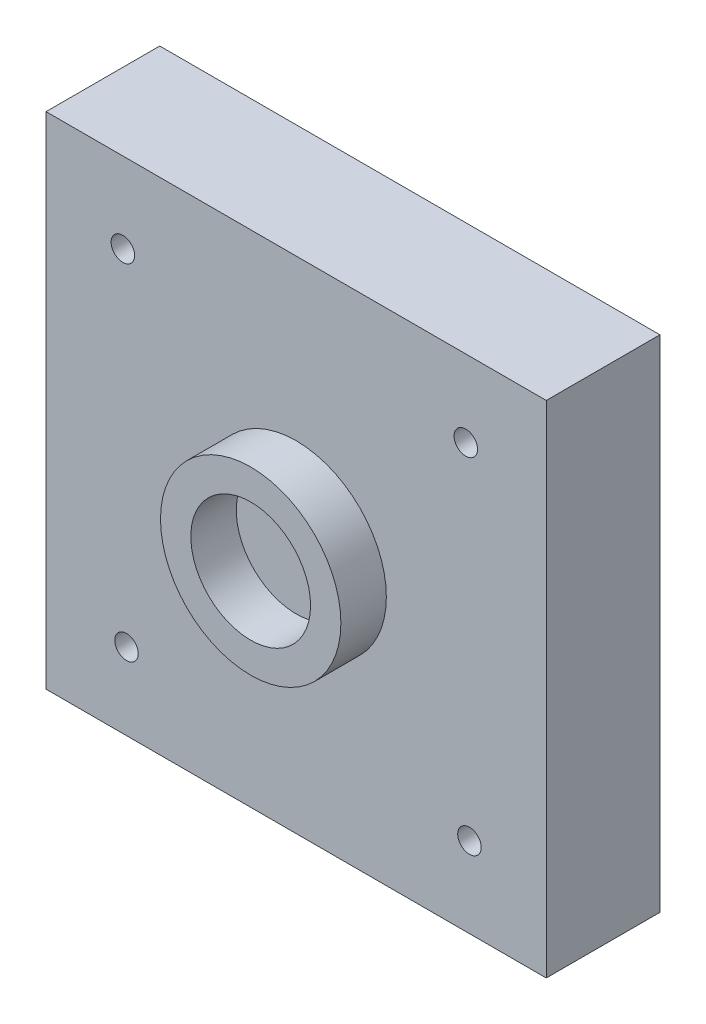
ISO-10303-21;
HEADER;
FILE_DESCRIPTION(('STEP AP214'),'2;1');
FILE_NAME('part.step','',(''),(''),'','','');
FILE_SCHEMA(('AUTOMOTIVE_DESIGN { 1 0 10303 214 1 1 1 1 }'));
ENDSEC;
DATA;
#1=APPLICATION_CONTEXT('core data for automotive mechanical design processes');
#2=APPLICATION_PROTOCOL_DEFINITION('international standard','automotive_design',2000,#1);
#3=PRODUCT_CONTEXT('',#1,'mechanical');
#4=PRODUCT('Part','Part','',(#3));
#5=PRODUCT_RELATED_PRODUCT_CATEGORY('part','',(#4));
#6=PRODUCT_DEFINITION_FORMATION('','',#4);
#7=PRODUCT_DEFINITION_CONTEXT('part definition',#1,'design');
#8=PRODUCT_DEFINITION('design','',#6,#7);
#9=PRODUCT_DEFINITION_SHAPE('','',#8);
#10=(LENGTH_UNIT() NAMED_UNIT(*) SI_UNIT(.MILLI.,.METRE.));
#11=(NAMED_UNIT(*) PLANE_ANGLE_UNIT() SI_UNIT($,.RADIAN.));
#12=(NAMED_UNIT(*) SI_UNIT($,.STERADIAN.) SOLID_ANGLE_UNIT());
#13=UNCERTAINTY_MEASURE_WITH_UNIT(LENGTH_MEASURE(1.E-05),#10,'distance_accuracy_value','');
#14=(GEOMETRIC_REPRESENTATION_CONTEXT(3) GLOBAL_UNCERTAINTY_ASSIGNED_CONTEXT((#13)) GLOBAL_UNIT_ASSIGNED_CONTEXT((#10,
#11,#12)) REPRESENTATION_CONTEXT('',''));
#15=CARTESIAN_POINT('',(0.,0.,0.));
#16=DIRECTION('',(0.,0.,1.));
#17=DIRECTION('',(1.,0.,0.));
#18=AXIS2_PLACEMENT_3D('',#15,#16,#17);
#19=CARTESIAN_POINT('',(0.,0.,15.));
#20=DIRECTION('',(0.,0.,1.));
#21=DIRECTION('',(1.,0.,0.));
#22=AXIS2_PLACEMENT_3D('',#19,#20,#21);
#23=PLANE('',#22);
#24=CARTESIAN_POINT('',(0.,0.,15.));
#25=DIRECTION('',(0.,0.,1.));
#26=DIRECTION('',(1.,0.,0.));
#27=AXIS2_PLACEMENT_3D('',#24,#25,#26);
#28=CIRCLE('',#27,11.9);
#29=CARTESIAN_POINT('',(11.9,0.,15.));
#30=VERTEX_POINT('',#29);
#31=EDGE_CURVE('E297',#30,#30,#28,.T.);
#32=ORIENTED_EDGE('',*,*,#31,.F.);
#33=EDGE_LOOP('',(#32));
#34=FACE_BOUND('',#33,.T.);
#35=DIRECTION('',(0.,1.,0.));
#36=VECTOR('',#35,1.);
#37=CARTESIAN_POINT('',(33.,0.,15.));
#38=LINE('',#37,#36);
#39=CARTESIAN_POINT('',(33.,-33.,15.));
#40=VERTEX_POINT('',#39);
#41=CARTESIAN_POINT('',(33.,33.,15.));
#42=VERTEX_POINT('',#41);
#43=EDGE_CURVE('E186',#40,#42,#38,.T.);
#44=ORIENTED_EDGE('',*,*,#43,.T.);
#45=DIRECTION('',(-1.,0.,0.));
#46=VECTOR('',#45,1.);
#47=CARTESIAN_POINT('',(0.,33.,15.));
#48=LINE('',#47,#46);
#49=CARTESIAN_POINT('',(-33.,33.,15.));
#50=VERTEX_POINT('',#49);
#51=EDGE_CURVE('E189',#42,#50,#48,.T.);
#52=ORIENTED_EDGE('',*,*,#51,.T.);
#53=DIRECTION('',(0.,-1.,0.));
#54=VECTOR('',#53,1.);
#55=CARTESIAN_POINT('',(-33.,0.,15.));
#56=LINE('',#55,#54);
#57=CARTESIAN_POINT('',(-33.,-33.,15.));
#58=VERTEX_POINT('',#57);
#59=EDGE_CURVE('E192',#50,#58,#56,.T.);
#60=ORIENTED_EDGE('',*,*,#59,.T.);
#61=DIRECTION('',(1.,0.,0.));
#62=VECTOR('',#61,1.);
#63=CARTESIAN_POINT('',(0.,-33.,15.));
#64=LINE('',#63,#62);
#65=EDGE_CURVE('E194',#58,#40,#64,.T.);
#66=ORIENTED_EDGE('',*,*,#65,.T.);
#67=EDGE_LOOP('',(#44,#52,#60,#66));
#68=FACE_BOUND('',#67,.T.);
#69=CARTESIAN_POINT('',(22.3843001966621,22.8679492894688,15.));
#70=DIRECTION('',(0.,0.,1.));
#71=DIRECTION('',(1.,0.,0.));
#72=AXIS2_PLACEMENT_3D('',#69,#70,#71);
#73=CIRCLE('',#72,1.55);
#74=CARTESIAN_POINT('',(23.9343001966621,22.8679492894688,15.));
#75=VERTEX_POINT('',#74);
#76=EDGE_CURVE('E165',#75,#75,#73,.T.);
#77=ORIENTED_EDGE('',*,*,#76,.F.);
#78=EDGE_LOOP('',(#77));
#79=FACE_BOUND('',#78,.T.);
#80=CARTESIAN_POINT('',(22.8679492894694,-22.3843001966621,15.));
#81=DIRECTION('',(0.,0.,1.));
#82=DIRECTION('',(1.,0.,0.));
#83=AXIS2_PLACEMENT_3D('',#80,#81,#82);
#84=CIRCLE('',#83,1.54999999999987);
#85=CARTESIAN_POINT('',(24.4179492894693,-22.3843001966621,15.));
#86=VERTEX_POINT('',#85);
#87=EDGE_CURVE('E260',#86,#86,#84,.T.);
#88=ORIENTED_EDGE('',*,*,#87,.F.);
#89=EDGE_LOOP('',(#88));
#90=FACE_BOUND('',#89,.T.);
#91=CARTESIAN_POINT('',(-22.3843001966614,-22.8679492894694,15.));
#92=DIRECTION('',(0.,0.,1.));
#93=DIRECTION('',(1.,0.,0.));
#94=AXIS2_PLACEMENT_3D('',#91,#92,#93);
#95=CIRCLE('',#94,1.55000000000053);
#96=CARTESIAN_POINT('',(-20.8343001966609,-22.8679492894694,15.));
#97=VERTEX_POINT('',#96);
#98=EDGE_CURVE('E253',#97,#97,#95,.T.);
#99=ORIENTED_EDGE('',*,*,#98,.F.);
#100=EDGE_LOOP('',(#99));
#101=FACE_BOUND('',#100,.T.);
#102=CARTESIAN_POINT('',(-22.8679492894688,22.3843001966614,15.));
#103=DIRECTION('',(0.,0.,1.));
#104=DIRECTION('',(1.,0.,0.));
#105=AXIS2_PLACEMENT_3D('',#102,#103,#104);
#106=CIRCLE('',#105,1.55000000000076);
#107=CARTESIAN_POINT('',(-21.317949289468,22.3843001966614,15.));
#108=VERTEX_POINT('',#107);
#109=EDGE_CURVE('E249',#108,#108,#106,.T.);
#110=ORIENTED_EDGE('',*,*,#109,.F.);
#111=EDGE_LOOP('',(#110));
#112=FACE_BOUND('',#111,.T.);
#113=ADVANCED_FACE('F83',(#34,#68,#79,#90,#101,#112),#23,.T.);
#114=CARTESIAN_POINT('',(0.,0.,0.));
#115=DIRECTION('',(0.,0.,1.));
#116=DIRECTION('',(1.,0.,0.));
#117=AXIS2_PLACEMENT_3D('',#114,#115,#116);
#118=PLANE('',#117);
#119=DIRECTION('',(0.,1.,0.));
#120=VECTOR('',#119,1.);
#121=CARTESIAN_POINT('',(33.,0.,0.));
#122=LINE('',#121,#120);
#123=CARTESIAN_POINT('',(33.,-33.,0.));
#124=VERTEX_POINT('',#123);
#125=CARTESIAN_POINT('',(33.,33.,0.));
#126=VERTEX_POINT('',#125);
#127=EDGE_CURVE('E185',#124,#126,#122,.T.);
#128=ORIENTED_EDGE('',*,*,#127,.F.);
#129=DIRECTION('',(1.,0.,0.));
#130=VECTOR('',#129,1.);
#131=CARTESIAN_POINT('',(0.,-33.,0.));
#132=LINE('',#131,#130);
#133=CARTESIAN_POINT('',(-33.,-33.,0.));
#134=VERTEX_POINT('',#133);
#135=EDGE_CURVE('E190',#134,#124,#132,.T.);
#136=ORIENTED_EDGE('',*,*,#135,.F.);
#137=DIRECTION('',(0.,-1.,0.));
#138=VECTOR('',#137,1.);
#139=CARTESIAN_POINT('',(-33.,0.,0.));
#140=LINE('',#139,#138);
#141=CARTESIAN_POINT('',(-33.,33.,0.));
#142=VERTEX_POINT('',#141);
#143=EDGE_CURVE('E201',#142,#134,#140,.T.);
#144=ORIENTED_EDGE('',*,*,#143,.F.);
#145=DIRECTION('',(-1.,0.,0.));
#146=VECTOR('',#145,1.);
#147=CARTESIAN_POINT('',(0.,33.,0.));
#148=LINE('',#147,#146);
#149=EDGE_CURVE('E199',#126,#142,#148,.T.);
#150=ORIENTED_EDGE('',*,*,#149,.F.);
#151=EDGE_LOOP('',(#128,#136,#144,#150));
#152=FACE_BOUND('',#151,.T.);
#153=DIRECTION('',(0.,1.,0.));
#154=VECTOR('',#153,1.);
#155=CARTESIAN_POINT('',(30.,30.,0.));
#156=LINE('',#155,#154);
#157=CARTESIAN_POINT('',(30.,-30.,0.));
#158=VERTEX_POINT('',#157);
#159=CARTESIAN_POINT('',(30.,30.,0.));
#160=VERTEX_POINT('',#159);
#161=EDGE_CURVE('E168',#158,#160,#156,.T.);
#162=ORIENTED_EDGE('',*,*,#161,.T.);
#163=DIRECTION('',(-1.,0.,0.));
#164=VECTOR('',#163,1.);
#165=CARTESIAN_POINT('',(30.,30.,0.));
#166=LINE('',#165,#164);
#167=CARTESIAN_POINT('',(-30.,30.,0.));
#168=VERTEX_POINT('',#167);
#169=EDGE_CURVE('E171',#160,#168,#166,.T.);
#170=ORIENTED_EDGE('',*,*,#169,.T.);
#171=DIRECTION('',(0.,-1.,0.));
#172=VECTOR('',#171,1.);
#173=CARTESIAN_POINT('',(-30.,30.,0.));
#174=LINE('',#173,#172);
#175=CARTESIAN_POINT('',(-30.,-30.,0.));
#176=VERTEX_POINT('',#175);
#177=EDGE_CURVE('E178',#168,#176,#174,.T.);
#178=ORIENTED_EDGE('',*,*,#177,.T.);
#179=DIRECTION('',(1.,0.,0.));
#180=VECTOR('',#179,1.);
#181=CARTESIAN_POINT('',(30.,-30.,0.));
#182=LINE('',#181,#180);
#183=EDGE_CURVE('E154',#176,#158,#182,.T.);
#184=ORIENTED_EDGE('',*,*,#183,.T.);
#185=EDGE_LOOP('',(#162,#170,#178,#184));
#186=FACE_BOUND('',#185,.T.);
#187=ADVANCED_FACE('F272',(#152,#186),#118,.F.);
#188=CARTESIAN_POINT('',(33.,0.,15.));
#189=DIRECTION('',(-1.,0.,0.));
#190=DIRECTION('',(0.,-1.,0.));
#191=AXIS2_PLACEMENT_3D('',#188,#189,#190);
#192=PLANE('',#191);
#193=ORIENTED_EDGE('',*,*,#127,.T.);
#194=DIRECTION('',(0.,0.,-1.));
#195=VECTOR('',#194,1.);
#196=CARTESIAN_POINT('',(33.,33.,15.));
#197=LINE('',#196,#195);
#198=EDGE_CURVE('E212',#42,#126,#197,.T.);
#199=ORIENTED_EDGE('',*,*,#198,.F.);
#200=ORIENTED_EDGE('',*,*,#43,.F.);
#201=DIRECTION('',(0.,0.,-1.));
#202=VECTOR('',#201,1.);
#203=CARTESIAN_POINT('',(33.,-33.,15.));
#204=LINE('',#203,#202);
#205=EDGE_CURVE('E196',#40,#124,#204,.T.);
#206=ORIENTED_EDGE('',*,*,#205,.T.);
#207=EDGE_LOOP('',(#193,#199,#200,#206));
#208=FACE_BOUND('',#207,.T.);
#209=ADVANCED_FACE('F85',(#208),#192,.F.);
#210=CARTESIAN_POINT('',(0.,33.,15.));
#211=DIRECTION('',(0.,-1.,0.));
#212=DIRECTION('',(1.,0.,0.));
#213=AXIS2_PLACEMENT_3D('',#210,#211,#212);
#214=PLANE('',#213);
#215=ORIENTED_EDGE('',*,*,#149,.T.);
#216=DIRECTION('',(0.,0.,-1.));
#217=VECTOR('',#216,1.);
#218=CARTESIAN_POINT('',(-33.,33.,15.));
#219=LINE('',#218,#217);
#220=EDGE_CURVE('E209',#50,#142,#219,.T.);
#221=ORIENTED_EDGE('',*,*,#220,.F.);
#222=ORIENTED_EDGE('',*,*,#51,.F.);
#223=ORIENTED_EDGE('',*,*,#198,.T.);
#224=EDGE_LOOP('',(#215,#221,#222,#223));
#225=FACE_BOUND('',#224,.T.);
#226=ADVANCED_FACE('F355',(#225),#214,.F.);
#227=CARTESIAN_POINT('',(-33.,0.,15.));
#228=DIRECTION('',(1.,0.,0.));
#229=DIRECTION('',(0.,1.,0.));
#230=AXIS2_PLACEMENT_3D('',#227,#228,#229);
#231=PLANE('',#230);
#232=ORIENTED_EDGE('',*,*,#143,.T.);
#233=DIRECTION('',(0.,0.,-1.));
#234=VECTOR('',#233,1.);
#235=CARTESIAN_POINT('',(-33.,-33.,15.));
#236=LINE('',#235,#234);
#237=EDGE_CURVE('E206',#58,#134,#236,.T.);
#238=ORIENTED_EDGE('',*,*,#237,.F.);
#239=ORIENTED_EDGE('',*,*,#59,.F.);
#240=ORIENTED_EDGE('',*,*,#220,.T.);
#241=EDGE_LOOP('',(#232,#238,#239,#240));
#242=FACE_BOUND('',#241,.T.);
#243=ADVANCED_FACE('F352',(#242),#231,.F.);
#244=CARTESIAN_POINT('',(0.,-33.,15.));
#245=DIRECTION('',(0.,1.,0.));
#246=DIRECTION('',(-1.,0.,0.));
#247=AXIS2_PLACEMENT_3D('',#244,#245,#246);
#248=PLANE('',#247);
#249=ORIENTED_EDGE('',*,*,#135,.T.);
#250=ORIENTED_EDGE('',*,*,#205,.F.);
#251=ORIENTED_EDGE('',*,*,#65,.F.);
#252=ORIENTED_EDGE('',*,*,#237,.T.);
#253=EDGE_LOOP('',(#249,#250,#251,#252));
#254=FACE_BOUND('',#253,.T.);
#255=ADVANCED_FACE('F345',(#254),#248,.F.);
#256=CARTESIAN_POINT('',(30.,30.,15.));
#257=DIRECTION('',(-1.,0.,0.));
#258=DIRECTION('',(0.,-1.,0.));
#259=AXIS2_PLACEMENT_3D('',#256,#257,#258);
#260=PLANE('',#259);
#261=DIRECTION('',(0.,-1.,0.));
#262=VECTOR('',#261,1.);
#263=CARTESIAN_POINT('',(30.,0.,10.));
#264=LINE('',#263,#262);
#265=CARTESIAN_POINT('',(30.,30.,10.));
#266=VERTEX_POINT('',#265);
#267=CARTESIAN_POINT('',(30.,-30.,10.));
#268=VERTEX_POINT('',#267);
#269=EDGE_CURVE('E98',#266,#268,#264,.T.);
#270=ORIENTED_EDGE('',*,*,#269,.F.);
#271=DIRECTION('',(0.,0.,-1.));
#272=VECTOR('',#271,1.);
#273=CARTESIAN_POINT('',(30.,30.,15.));
#274=LINE('',#273,#272);
#275=EDGE_CURVE('E183',#266,#160,#274,.T.);
#276=ORIENTED_EDGE('',*,*,#275,.T.);
#277=ORIENTED_EDGE('',*,*,#161,.F.);
#278=DIRECTION('',(0.,0.,-1.));
#279=VECTOR('',#278,1.);
#280=CARTESIAN_POINT('',(30.,-30.,15.));
#281=LINE('',#280,#279);
#282=EDGE_CURVE('E159',#268,#158,#281,.T.);
#283=ORIENTED_EDGE('',*,*,#282,.F.);
#284=EDGE_LOOP('',(#270,#276,#277,#283));
#285=FACE_BOUND('',#284,.T.);
#286=ADVANCED_FACE('F343',(#285),#260,.T.);
#287=CARTESIAN_POINT('',(30.,30.,15.));
#288=DIRECTION('',(0.,-1.,0.));
#289=DIRECTION('',(1.,0.,0.));
#290=AXIS2_PLACEMENT_3D('',#287,#288,#289);
#291=PLANE('',#290);
#292=DIRECTION('',(1.,0.,0.));
#293=VECTOR('',#292,1.);
#294=CARTESIAN_POINT('',(0.,30.,10.));
#295=LINE('',#294,#293);
#296=CARTESIAN_POINT('',(-30.,30.,10.));
#297=VERTEX_POINT('',#296);
#298=EDGE_CURVE('E105',#297,#266,#295,.T.);
#299=ORIENTED_EDGE('',*,*,#298,.F.);
#300=DIRECTION('',(0.,0.,-1.));
#301=VECTOR('',#300,1.);
#302=CARTESIAN_POINT('',(-30.,30.,15.));
#303=LINE('',#302,#301);
#304=EDGE_CURVE('E158',#297,#168,#303,.T.);
#305=ORIENTED_EDGE('',*,*,#304,.T.);
#306=ORIENTED_EDGE('',*,*,#169,.F.);
#307=ORIENTED_EDGE('',*,*,#275,.F.);
#308=EDGE_LOOP('',(#299,#305,#306,#307));
#309=FACE_BOUND('',#308,.T.);
#310=ADVANCED_FACE('F340',(#309),#291,.T.);
#311=CARTESIAN_POINT('',(-30.,30.,15.));
#312=DIRECTION('',(1.,0.,0.));
#313=DIRECTION('',(0.,1.,0.));
#314=AXIS2_PLACEMENT_3D('',#311,#312,#313);
#315=PLANE('',#314);
#316=DIRECTION('',(0.,1.,0.));
#317=VECTOR('',#316,1.);
#318=CARTESIAN_POINT('',(-30.,0.,10.));
#319=LINE('',#318,#317);
#320=CARTESIAN_POINT('',(-30.,-30.,10.));
#321=VERTEX_POINT('',#320);
#322=EDGE_CURVE('E162',#321,#297,#319,.T.);
#323=ORIENTED_EDGE('',*,*,#322,.F.);
#324=DIRECTION('',(0.,0.,-1.));
#325=VECTOR('',#324,1.);
#326=CARTESIAN_POINT('',(-30.,-30.,15.));
#327=LINE('',#326,#325);
#328=EDGE_CURVE('E148',#321,#176,#327,.T.);
#329=ORIENTED_EDGE('',*,*,#328,.T.);
#330=ORIENTED_EDGE('',*,*,#177,.F.);
#331=ORIENTED_EDGE('',*,*,#304,.F.);
#332=EDGE_LOOP('',(#323,#329,#330,#331));
#333=FACE_BOUND('',#332,.T.);
#334=ADVANCED_FACE('F163',(#333),#315,.T.);
#335=CARTESIAN_POINT('',(30.,-30.,15.));
#336=DIRECTION('',(0.,1.,0.));
#337=DIRECTION('',(-1.,0.,0.));
#338=AXIS2_PLACEMENT_3D('',#335,#336,#337);
#339=PLANE('',#338);
#340=DIRECTION('',(-1.,0.,0.));
#341=VECTOR('',#340,1.);
#342=CARTESIAN_POINT('',(0.,-30.,10.));
#343=LINE('',#342,#341);
#344=EDGE_CURVE('E152',#268,#321,#343,.T.);
#345=ORIENTED_EDGE('',*,*,#344,.F.);
#346=ORIENTED_EDGE('',*,*,#282,.T.);
#347=ORIENTED_EDGE('',*,*,#183,.F.);
#348=ORIENTED_EDGE('',*,*,#328,.F.);
#349=EDGE_LOOP('',(#345,#346,#347,#348));
#350=FACE_BOUND('',#349,.T.);
#351=ADVANCED_FACE('F150',(#350),#339,.T.);
#352=CARTESIAN_POINT('',(0.,0.,10.));
#353=DIRECTION('',(0.,0.,-1.));
#354=DIRECTION('',(-1.,0.,0.));
#355=AXIS2_PLACEMENT_3D('',#352,#353,#354);
#356=PLANE('',#355);
#357=CARTESIAN_POINT('',(-22.8679492894688,22.3843001966614,10.));
#358=DIRECTION('',(0.,0.,-1.));
#359=DIRECTION('',(-1.,0.,0.));
#360=AXIS2_PLACEMENT_3D('',#357,#358,#359);
#361=CIRCLE('',#360,3.55000000000076);
#362=CARTESIAN_POINT('',(-26.4179492894695,22.3843001966614,10.));
#363=VERTEX_POINT('',#362);
#364=EDGE_CURVE('E91',#363,#363,#361,.T.);
#365=ORIENTED_EDGE('',*,*,#364,.F.);
#366=EDGE_LOOP('',(#365));
#367=FACE_BOUND('',#366,.T.);
#368=CARTESIAN_POINT('',(-22.3843001966614,-22.8679492894694,10.));
#369=DIRECTION('',(0.,0.,-1.));
#370=DIRECTION('',(-1.,0.,0.));
#371=AXIS2_PLACEMENT_3D('',#368,#369,#370);
#372=CIRCLE('',#371,3.55000000000053);
#373=CARTESIAN_POINT('',(-25.934300196662,-22.8679492894694,10.));
#374=VERTEX_POINT('',#373);
#375=EDGE_CURVE('E221',#374,#374,#372,.T.);
#376=ORIENTED_EDGE('',*,*,#375,.F.);
#377=EDGE_LOOP('',(#376));
#378=FACE_BOUND('',#377,.T.);
#379=CARTESIAN_POINT('',(22.8679492894694,-22.3843001966621,10.));
#380=DIRECTION('',(0.,0.,-1.));
#381=DIRECTION('',(-1.,0.,0.));
#382=AXIS2_PLACEMENT_3D('',#379,#380,#381);
#383=CIRCLE('',#382,3.54999999999987);
#384=CARTESIAN_POINT('',(19.3179492894695,-22.3843001966621,10.));
#385=VERTEX_POINT('',#384);
#386=EDGE_CURVE('E218',#385,#385,#383,.T.);
#387=ORIENTED_EDGE('',*,*,#386,.F.);
#388=EDGE_LOOP('',(#387));
#389=FACE_BOUND('',#388,.T.);
#390=CARTESIAN_POINT('',(22.3843001966621,22.8679492894688,10.));
#391=DIRECTION('',(0.,0.,-1.));
#392=DIRECTION('',(-1.,0.,0.));
#393=AXIS2_PLACEMENT_3D('',#390,#391,#392);
#394=CIRCLE('',#393,3.55);
#395=CARTESIAN_POINT('',(18.8343001966621,22.8679492894688,10.));
#396=VERTEX_POINT('',#395);
#397=EDGE_CURVE('E215',#396,#396,#394,.T.);
#398=ORIENTED_EDGE('',*,*,#397,.F.);
#399=EDGE_LOOP('',(#398));
#400=FACE_BOUND('',#399,.T.);
#401=ORIENTED_EDGE('',*,*,#322,.T.);
#402=ORIENTED_EDGE('',*,*,#298,.T.);
#403=ORIENTED_EDGE('',*,*,#269,.T.);
#404=ORIENTED_EDGE('',*,*,#344,.T.);
#405=EDGE_LOOP('',(#401,#402,#403,#404));
#406=FACE_BOUND('',#405,.T.);
#407=ADVANCED_FACE('F167',(#367,#378,#389,#400,#406),#356,.T.);
#408=CARTESIAN_POINT('',(22.3843001966621,22.8679492894688,0.));
#409=DIRECTION('',(0.,0.,1.));
#410=DIRECTION('',(1.,0.,0.));
#411=AXIS2_PLACEMENT_3D('',#408,#409,#410);
#412=CYLINDRICAL_SURFACE('',#411,1.55);
#413=ORIENTED_EDGE('',*,*,#76,.T.);
#414=EDGE_LOOP('',(#413));
#415=FACE_BOUND('',#414,.T.);
#416=CARTESIAN_POINT('',(22.3843001966614,22.86794928947,0.));
#417=DIRECTION('',(0.,0.,1.));
#418=DIRECTION('',(0.,-1.,0.));
#419=AXIS2_PLACEMENT_3D('',#416,#417,#418);
#420=CIRCLE('',#419,1.55000000000207);
#421=CARTESIAN_POINT('',(22.3843001966614,21.317949289468,0.));
#422=VERTEX_POINT('',#421);
#423=EDGE_CURVE('E250',#422,#422,#420,.T.);
#424=ORIENTED_EDGE('',*,*,#423,.F.);
#425=EDGE_LOOP('',(#424));
#426=FACE_BOUND('',#425,.T.);
#427=ADVANCED_FACE('F231',(#415,#426),#412,.F.);
#428=CARTESIAN_POINT('',(22.8679492894694,-22.3843001966621,0.));
#429=DIRECTION('',(0.,0.,1.));
#430=DIRECTION('',(1.,0.,0.));
#431=AXIS2_PLACEMENT_3D('',#428,#429,#430);
#432=CYLINDRICAL_SURFACE('',#431,1.54999999999987);
#433=ORIENTED_EDGE('',*,*,#87,.T.);
#434=EDGE_LOOP('',(#433));
#435=FACE_BOUND('',#434,.T.);
#436=CARTESIAN_POINT('',(22.86794928947,-22.3843001966601,0.));
#437=DIRECTION('',(0.,0.,1.));
#438=DIRECTION('',(0.,-1.,0.));
#439=AXIS2_PLACEMENT_3D('',#436,#437,#438);
#440=CIRCLE('',#439,1.55000000000255);
#441=CARTESIAN_POINT('',(22.86794928947,-23.9343001966627,0.));
#442=VERTEX_POINT('',#441);
#443=EDGE_CURVE('E304',#442,#442,#440,.T.);
#444=ORIENTED_EDGE('',*,*,#443,.F.);
#445=EDGE_LOOP('',(#444));
#446=FACE_BOUND('',#445,.T.);
#447=ADVANCED_FACE('F327',(#435,#446),#432,.F.);
#448=CARTESIAN_POINT('',(-22.3843001966614,-22.8679492894694,0.));
#449=DIRECTION('',(0.,0.,1.));
#450=DIRECTION('',(1.,0.,0.));
#451=AXIS2_PLACEMENT_3D('',#448,#449,#450);
#452=CYLINDRICAL_SURFACE('',#451,1.55000000000053);
#453=ORIENTED_EDGE('',*,*,#98,.T.);
#454=EDGE_LOOP('',(#453));
#455=FACE_BOUND('',#454,.T.);
#456=CARTESIAN_POINT('',(-22.3843001966602,-22.8679492894688,0.));
#457=DIRECTION('',(0.,0.,1.));
#458=DIRECTION('',(0.,-1.,0.));
#459=AXIS2_PLACEMENT_3D('',#456,#457,#458);
#460=CIRCLE('',#459,1.55000000000142);
#461=CARTESIAN_POINT('',(-22.3843001966602,-24.4179492894702,0.));
#462=VERTEX_POINT('',#461);
#463=EDGE_CURVE('E301',#462,#462,#460,.T.);
#464=ORIENTED_EDGE('',*,*,#463,.F.);
#465=EDGE_LOOP('',(#464));
#466=FACE_BOUND('',#465,.T.);
#467=ADVANCED_FACE('F284',(#455,#466),#452,.F.);
#468=CARTESIAN_POINT('',(-22.8679492894688,22.3843001966614,0.));
#469=DIRECTION('',(0.,0.,1.));
#470=DIRECTION('',(1.,0.,0.));
#471=AXIS2_PLACEMENT_3D('',#468,#469,#470);
#472=CYLINDRICAL_SURFACE('',#471,1.55000000000076);
#473=ORIENTED_EDGE('',*,*,#109,.T.);
#474=EDGE_LOOP('',(#473));
#475=FACE_BOUND('',#474,.T.);
#476=CARTESIAN_POINT('',(-22.8679492894688,22.3843001966614,0.));
#477=DIRECTION('',(0.,0.,1.));
#478=DIRECTION('',(0.,-1.,0.));
#479=AXIS2_PLACEMENT_3D('',#476,#477,#478);
#480=CIRCLE('',#479,1.55000000000076);
#481=CARTESIAN_POINT('',(-22.8679492894688,20.8343001966607,0.));
#482=VERTEX_POINT('',#481);
#483=EDGE_CURVE('E288',#482,#482,#480,.T.);
#484=ORIENTED_EDGE('',*,*,#483,.F.);
#485=EDGE_LOOP('',(#484));
#486=FACE_BOUND('',#485,.T.);
#487=ADVANCED_FACE('F243',(#475,#486),#472,.F.);
#488=CARTESIAN_POINT('',(22.3843001966621,22.8679492894688,-10.0409162928511));
#489=DIRECTION('',(0.,0.,1.));
#490=DIRECTION('',(1.,0.,0.));
#491=AXIS2_PLACEMENT_3D('',#488,#489,#490);
#492=CYLINDRICAL_SURFACE('',#491,3.55);
#493=ORIENTED_EDGE('',*,*,#397,.T.);
#494=EDGE_LOOP('',(#493));
#495=FACE_BOUND('',#494,.T.);
#496=CARTESIAN_POINT('',(22.3843001966621,22.8679492894688,0.));
#497=DIRECTION('',(0.,0.,1.));
#498=DIRECTION('',(1.,0.,0.));
#499=AXIS2_PLACEMENT_3D('',#496,#497,#498);
#500=CIRCLE('',#499,3.55);
#501=CARTESIAN_POINT('',(25.9343001966621,22.8679492894688,0.));
#502=VERTEX_POINT('',#501);
#503=EDGE_CURVE('E247',#502,#502,#500,.F.);
#504=ORIENTED_EDGE('',*,*,#503,.F.);
#505=EDGE_LOOP('',(#504));
#506=FACE_BOUND('',#505,.T.);
#507=ADVANCED_FACE('F239',(#495,#506),#492,.T.);
#508=CARTESIAN_POINT('',(0.,0.,0.));
#509=DIRECTION('',(0.,0.,1.));
#510=DIRECTION('',(0.,-1.,0.));
#511=AXIS2_PLACEMENT_3D('',#508,#509,#510);
#512=PLANE('',#511);
#513=ORIENTED_EDGE('',*,*,#503,.T.);
#514=EDGE_LOOP('',(#513));
#515=FACE_BOUND('',#514,.T.);
#516=ORIENTED_EDGE('',*,*,#423,.T.);
#517=EDGE_LOOP('',(#516));
#518=FACE_BOUND('',#517,.T.);
#519=ADVANCED_FACE('F242',(#515,#518),#512,.F.);
#520=CARTESIAN_POINT('',(22.8679492894694,-22.3843001966621,-10.0409162928511));
#521=DIRECTION('',(0.,0.,1.));
#522=DIRECTION('',(1.,0.,0.));
#523=AXIS2_PLACEMENT_3D('',#520,#521,#522);
#524=CYLINDRICAL_SURFACE('',#523,3.54999999999987);
#525=ORIENTED_EDGE('',*,*,#386,.T.);
#526=EDGE_LOOP('',(#525));
#527=FACE_BOUND('',#526,.T.);
#528=CARTESIAN_POINT('',(22.8679492894694,-22.3843001966621,0.));
#529=DIRECTION('',(0.,0.,1.));
#530=DIRECTION('',(1.,0.,0.));
#531=AXIS2_PLACEMENT_3D('',#528,#529,#530);
#532=CIRCLE('',#531,3.54999999999987);
#533=CARTESIAN_POINT('',(26.4179492894693,-22.3843001966621,0.));
#534=VERTEX_POINT('',#533);
#535=EDGE_CURVE('E256',#534,#534,#532,.F.);
#536=ORIENTED_EDGE('',*,*,#535,.F.);
#537=EDGE_LOOP('',(#536));
#538=FACE_BOUND('',#537,.T.);
#539=ADVANCED_FACE('F314',(#527,#538),#524,.T.);
#540=CARTESIAN_POINT('',(0.,0.,0.));
#541=DIRECTION('',(0.,0.,1.));
#542=DIRECTION('',(0.,-1.,0.));
#543=AXIS2_PLACEMENT_3D('',#540,#541,#542);
#544=PLANE('',#543);
#545=ORIENTED_EDGE('',*,*,#535,.T.);
#546=EDGE_LOOP('',(#545));
#547=FACE_BOUND('',#546,.T.);
#548=ORIENTED_EDGE('',*,*,#443,.T.);
#549=EDGE_LOOP('',(#548));
#550=FACE_BOUND('',#549,.T.);
#551=ADVANCED_FACE('F311',(#547,#550),#544,.F.);
#552=CARTESIAN_POINT('',(-22.3843001966614,-22.8679492894694,-10.0409162928511));
#553=DIRECTION('',(0.,0.,1.));
#554=DIRECTION('',(1.,0.,0.));
#555=AXIS2_PLACEMENT_3D('',#552,#553,#554);
#556=CYLINDRICAL_SURFACE('',#555,3.55000000000053);
#557=ORIENTED_EDGE('',*,*,#375,.T.);
#558=EDGE_LOOP('',(#557));
#559=FACE_BOUND('',#558,.T.);
#560=CARTESIAN_POINT('',(-22.3843001966614,-22.8679492894694,0.));
#561=DIRECTION('',(0.,0.,1.));
#562=DIRECTION('',(1.,0.,0.));
#563=AXIS2_PLACEMENT_3D('',#560,#561,#562);
#564=CIRCLE('',#563,3.55000000000053);
#565=CARTESIAN_POINT('',(-18.8343001966609,-22.8679492894694,0.));
#566=VERTEX_POINT('',#565);
#567=EDGE_CURVE('E294',#566,#566,#564,.F.);
#568=ORIENTED_EDGE('',*,*,#567,.F.);
#569=EDGE_LOOP('',(#568));
#570=FACE_BOUND('',#569,.T.);
#571=ADVANCED_FACE('F322',(#559,#570),#556,.T.);
#572=CARTESIAN_POINT('',(0.,0.,0.));
#573=DIRECTION('',(0.,0.,1.));
#574=DIRECTION('',(0.,-1.,0.));
#575=AXIS2_PLACEMENT_3D('',#572,#573,#574);
#576=PLANE('',#575);
#577=ORIENTED_EDGE('',*,*,#567,.T.);
#578=EDGE_LOOP('',(#577));
#579=FACE_BOUND('',#578,.T.);
#580=ORIENTED_EDGE('',*,*,#463,.T.);
#581=EDGE_LOOP('',(#580));
#582=FACE_BOUND('',#581,.T.);
#583=ADVANCED_FACE('F450',(#579,#582),#576,.F.);
#584=CARTESIAN_POINT('',(-22.8679492894688,22.3843001966614,-10.0409162928511));
#585=DIRECTION('',(0.,0.,1.));
#586=DIRECTION('',(1.,0.,0.));
#587=AXIS2_PLACEMENT_3D('',#584,#585,#586);
#588=CYLINDRICAL_SURFACE('',#587,3.55000000000076);
#589=ORIENTED_EDGE('',*,*,#364,.T.);
#590=EDGE_LOOP('',(#589));
#591=FACE_BOUND('',#590,.T.);
#592=CARTESIAN_POINT('',(-22.8679492894688,22.3843001966614,0.));
#593=DIRECTION('',(0.,0.,1.));
#594=DIRECTION('',(1.,0.,0.));
#595=AXIS2_PLACEMENT_3D('',#592,#593,#594);
#596=CIRCLE('',#595,3.55000000000076);
#597=CARTESIAN_POINT('',(-19.317949289468,22.3843001966614,0.));
#598=VERTEX_POINT('',#597);
#599=EDGE_CURVE('E290',#598,#598,#596,.F.);
#600=ORIENTED_EDGE('',*,*,#599,.F.);
#601=EDGE_LOOP('',(#600));
#602=FACE_BOUND('',#601,.T.);
#603=ADVANCED_FACE('F226',(#591,#602),#588,.T.);
#604=CARTESIAN_POINT('',(0.,0.,0.));
#605=DIRECTION('',(0.,0.,1.));
#606=DIRECTION('',(0.,-1.,0.));
#607=AXIS2_PLACEMENT_3D('',#604,#605,#606);
#608=PLANE('',#607);
#609=ORIENTED_EDGE('',*,*,#599,.T.);
#610=EDGE_LOOP('',(#609));
#611=FACE_BOUND('',#610,.T.);
#612=ORIENTED_EDGE('',*,*,#483,.T.);
#613=EDGE_LOOP('',(#612));
#614=FACE_BOUND('',#613,.T.);
#615=ADVANCED_FACE('F396',(#611,#614),#608,.F.);
#616=CARTESIAN_POINT('',(0.,0.,21.));
#617=DIRECTION('',(0.,0.,1.));
#618=DIRECTION('',(1.,0.,0.));
#619=AXIS2_PLACEMENT_3D('',#616,#617,#618);
#620=PLANE('',#619);
#621=CARTESIAN_POINT('',(0.,0.,21.));
#622=DIRECTION('',(0.,0.,1.));
#623=DIRECTION('',(1.,0.,0.));
#624=AXIS2_PLACEMENT_3D('',#621,#622,#623);
#625=CIRCLE('',#624,11.9);
#626=CARTESIAN_POINT('',(11.9,0.,21.));
#627=VERTEX_POINT('',#626);
#628=EDGE_CURVE('E291',#627,#627,#625,.T.);
#629=ORIENTED_EDGE('',*,*,#628,.T.);
#630=EDGE_LOOP('',(#629));
#631=FACE_BOUND('',#630,.T.);
#632=CARTESIAN_POINT('',(0.,0.,21.));
#633=DIRECTION('',(0.,0.,1.));
#634=DIRECTION('',(1.,0.,0.));
#635=AXIS2_PLACEMENT_3D('',#632,#633,#634);
#636=CIRCLE('',#635,7.9);
#637=CARTESIAN_POINT('',(7.9,0.,21.));
#638=VERTEX_POINT('',#637);
#639=EDGE_CURVE('E589',#638,#638,#636,.T.);
#640=ORIENTED_EDGE('',*,*,#639,.F.);
#641=EDGE_LOOP('',(#640));
#642=FACE_BOUND('',#641,.T.);
#643=ADVANCED_FACE('F401',(#631,#642),#620,.T.);
#644=CARTESIAN_POINT('',(0.,0.,21.));
#645=DIRECTION('',(0.,0.,-1.));
#646=DIRECTION('',(-1.,0.,0.));
#647=AXIS2_PLACEMENT_3D('',#644,#645,#646);
#648=CYLINDRICAL_SURFACE('',#647,11.9);
#649=ORIENTED_EDGE('',*,*,#628,.F.);
#650=EDGE_LOOP('',(#649));
#651=FACE_BOUND('',#650,.T.);
#652=ORIENTED_EDGE('',*,*,#31,.T.);
#653=EDGE_LOOP('',(#652));
#654=FACE_BOUND('',#653,.T.);
#655=ADVANCED_FACE('F406',(#651,#654),#648,.T.);
#656=CARTESIAN_POINT('',(0.,0.,21.));
#657=DIRECTION('',(0.,0.,-1.));
#658=DIRECTION('',(-1.,0.,0.));
#659=AXIS2_PLACEMENT_3D('',#656,#657,#658);
#660=CYLINDRICAL_SURFACE('',#659,7.9);
#661=ORIENTED_EDGE('',*,*,#639,.T.);
#662=EDGE_LOOP('',(#661));
#663=FACE_BOUND('',#662,.T.);
#664=CARTESIAN_POINT('',(0.,0.,15.));
#665=DIRECTION('',(0.,0.,1.));
#666=DIRECTION('',(1.,0.,0.));
#667=AXIS2_PLACEMENT_3D('',#664,#665,#666);
#668=CIRCLE('',#667,7.9);
#669=CARTESIAN_POINT('',(7.9,0.,15.));
#670=VERTEX_POINT('',#669);
#671=EDGE_CURVE('E12',#670,#670,#668,.F.);
#672=ORIENTED_EDGE('',*,*,#671,.T.);
#673=EDGE_LOOP('',(#672));
#674=FACE_BOUND('',#673,.T.);
#675=ADVANCED_FACE('F417',(#663,#674),#660,.F.);
#676=ORIENTED_EDGE('',*,*,#671,.F.);
#677=EDGE_LOOP('',(#676));
#678=FACE_BOUND('',#677,.T.);
#679=ADVANCED_FACE('F275',(#678),#23,.T.);
#680=CLOSED_SHELL('',(#113,#187,#209,#226,#243,#255,#286,#310,#334,#351,#407,#427,#447,#467,
#487,#507,#519,#539,#551,#571,#583,#603,#615,#643,#655,#675,#679));
#681=MANIFOLD_SOLID_BREP('B2',#680);
#682=ADVANCED_BREP_SHAPE_REPRESENTATION('',(#18,#681),#14);
#683=SHAPE_DEFINITION_REPRESENTATION(#9,#682);
ENDSEC;
END-ISO-10303-21;
